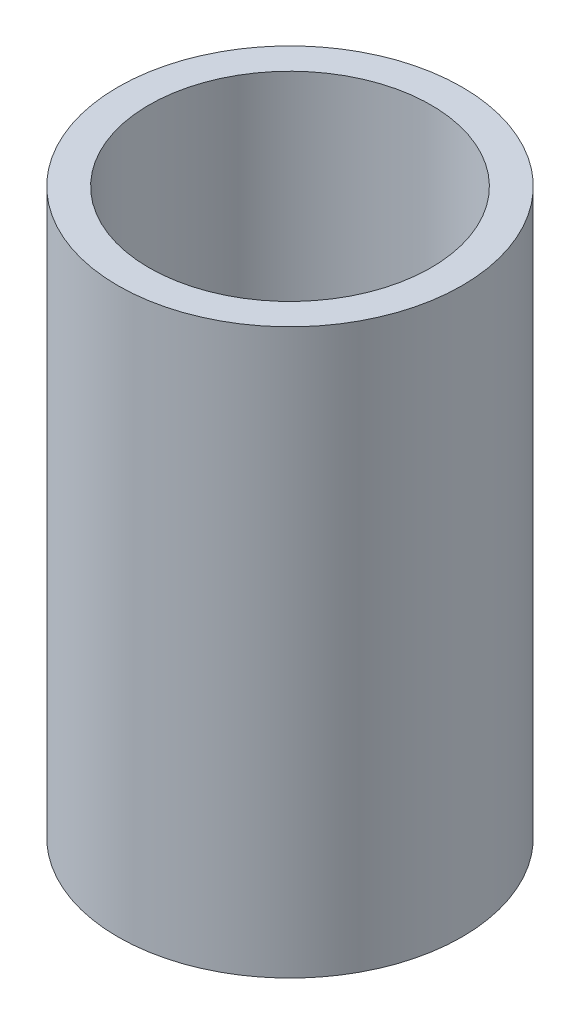
ISO-10303-21;
HEADER;
FILE_DESCRIPTION(('STEP AP214'),'2;1');
FILE_NAME('part.step','',(''),(''),'','','');
FILE_SCHEMA(('AUTOMOTIVE_DESIGN { 1 0 10303 214 1 1 1 1 }'));
ENDSEC;
DATA;
#1=APPLICATION_CONTEXT('core data for automotive mechanical design processes');
#2=APPLICATION_PROTOCOL_DEFINITION('international standard','automotive_design',2000,#1);
#3=PRODUCT_CONTEXT('',#1,'mechanical');
#4=PRODUCT('Part','Part','',(#3));
#5=PRODUCT_RELATED_PRODUCT_CATEGORY('part','',(#4));
#6=PRODUCT_DEFINITION_FORMATION('','',#4);
#7=PRODUCT_DEFINITION_CONTEXT('part definition',#1,'design');
#8=PRODUCT_DEFINITION('design','',#6,#7);
#9=PRODUCT_DEFINITION_SHAPE('','',#8);
#10=(LENGTH_UNIT() NAMED_UNIT(*) SI_UNIT(.MILLI.,.METRE.));
#11=(NAMED_UNIT(*) PLANE_ANGLE_UNIT() SI_UNIT($,.RADIAN.));
#12=(NAMED_UNIT(*) SI_UNIT($,.STERADIAN.) SOLID_ANGLE_UNIT());
#13=UNCERTAINTY_MEASURE_WITH_UNIT(LENGTH_MEASURE(1.E-05),#10,'distance_accuracy_value','');
#14=(GEOMETRIC_REPRESENTATION_CONTEXT(3) GLOBAL_UNCERTAINTY_ASSIGNED_CONTEXT((#13)) GLOBAL_UNIT_ASSIGNED_CONTEXT((#10,
#11,#12)) REPRESENTATION_CONTEXT('',''));
#15=CARTESIAN_POINT('',(0.,0.,0.));
#16=DIRECTION('',(0.,0.,1.));
#17=DIRECTION('',(1.,0.,0.));
#18=AXIS2_PLACEMENT_3D('',#15,#16,#17);
#19=CARTESIAN_POINT('',(0.,9.5,0.));
#20=DIRECTION('',(0.,1.,0.));
#21=DIRECTION('',(0.,0.,1.));
#22=AXIS2_PLACEMENT_3D('',#19,#20,#21);
#23=PLANE('',#22);
#24=CARTESIAN_POINT('',(0.,9.5,0.));
#25=DIRECTION('',(0.,1.,0.));
#26=DIRECTION('',(0.,0.,1.));
#27=AXIS2_PLACEMENT_3D('',#24,#25,#26);
#28=CIRCLE('',#27,3.05);
#29=CARTESIAN_POINT('',(0.,9.5,3.05));
#30=VERTEX_POINT('',#29);
#31=EDGE_CURVE('E10',#30,#30,#28,.T.);
#32=ORIENTED_EDGE('',*,*,#31,.T.);
#33=EDGE_LOOP('',(#32));
#34=FACE_BOUND('',#33,.T.);
#35=CARTESIAN_POINT('',(0.,9.5,0.));
#36=DIRECTION('',(0.,1.,0.));
#37=DIRECTION('',(0.,0.,1.));
#38=AXIS2_PLACEMENT_3D('',#35,#36,#37);
#39=CIRCLE('',#38,2.5);
#40=CARTESIAN_POINT('',(0.,9.5,2.5));
#41=VERTEX_POINT('',#40);
#42=EDGE_CURVE('E44',#41,#41,#39,.T.);
#43=ORIENTED_EDGE('',*,*,#42,.F.);
#44=EDGE_LOOP('',(#43));
#45=FACE_BOUND('',#44,.T.);
#46=ADVANCED_FACE('F37',(#34,#45),#23,.T.);
#47=CARTESIAN_POINT('',(0.,9.5,0.));
#48=DIRECTION('',(0.,-1.,0.));
#49=DIRECTION('',(0.,0.,-1.));
#50=AXIS2_PLACEMENT_3D('',#47,#48,#49);
#51=CYLINDRICAL_SURFACE('',#50,3.05);
#52=ORIENTED_EDGE('',*,*,#31,.F.);
#53=EDGE_LOOP('',(#52));
#54=FACE_BOUND('',#53,.T.);
#55=CARTESIAN_POINT('',(0.,-0.5,0.));
#56=DIRECTION('',(0.,-1.,0.));
#57=DIRECTION('',(0.,0.,-1.));
#58=AXIS2_PLACEMENT_3D('',#55,#56,#57);
#59=CIRCLE('',#58,3.05);
#60=CARTESIAN_POINT('',(0.,-0.5,-3.05));
#61=VERTEX_POINT('',#60);
#62=EDGE_CURVE('E53',#61,#61,#59,.T.);
#63=ORIENTED_EDGE('',*,*,#62,.F.);
#64=EDGE_LOOP('',(#63));
#65=FACE_BOUND('',#64,.T.);
#66=ADVANCED_FACE('F39',(#54,#65),#51,.T.);
#67=CARTESIAN_POINT('',(0.,9.5,0.));
#68=DIRECTION('',(0.,-1.,0.));
#69=DIRECTION('',(0.,0.,-1.));
#70=AXIS2_PLACEMENT_3D('',#67,#68,#69);
#71=CYLINDRICAL_SURFACE('',#70,2.5);
#72=ORIENTED_EDGE('',*,*,#42,.T.);
#73=EDGE_LOOP('',(#72));
#74=FACE_BOUND('',#73,.T.);
#75=CARTESIAN_POINT('',(0.,0.,0.));
#76=DIRECTION('',(0.,1.,0.));
#77=DIRECTION('',(0.,0.,1.));
#78=AXIS2_PLACEMENT_3D('',#75,#76,#77);
#79=CIRCLE('',#78,2.5);
#80=CARTESIAN_POINT('',(0.,0.,2.5));
#81=VERTEX_POINT('',#80);
#82=EDGE_CURVE('E48',#81,#81,#79,.T.);
#83=ORIENTED_EDGE('',*,*,#82,.F.);
#84=EDGE_LOOP('',(#83));
#85=FACE_BOUND('',#84,.T.);
#86=ADVANCED_FACE('F61',(#74,#85),#71,.F.);
#87=CARTESIAN_POINT('',(0.,0.,0.));
#88=DIRECTION('',(0.,-1.,0.));
#89=DIRECTION('',(0.,0.,-1.));
#90=AXIS2_PLACEMENT_3D('',#87,#88,#89);
#91=PLANE('',#90);
#92=ORIENTED_EDGE('',*,*,#82,.T.);
#93=EDGE_LOOP('',(#92));
#94=FACE_BOUND('',#93,.T.);
#95=ADVANCED_FACE('F67',(#94),#91,.F.);
#96=CARTESIAN_POINT('',(0.,-0.5,0.));
#97=DIRECTION('',(0.,-1.,0.));
#98=DIRECTION('',(0.,0.,-1.));
#99=AXIS2_PLACEMENT_3D('',#96,#97,#98);
#100=PLANE('',#99);
#101=ORIENTED_EDGE('',*,*,#62,.T.);
#102=EDGE_LOOP('',(#101));
#103=FACE_BOUND('',#102,.T.);
#104=ADVANCED_FACE('F58',(#103),#100,.T.);
#105=CLOSED_SHELL('',(#46,#66,#86,#95,#104));
#106=MANIFOLD_SOLID_BREP('B2',#105);
#107=ADVANCED_BREP_SHAPE_REPRESENTATION('',(#18,#106),#14);
#108=SHAPE_DEFINITION_REPRESENTATION(#9,#107);
ENDSEC;
END-ISO-10303-21;
